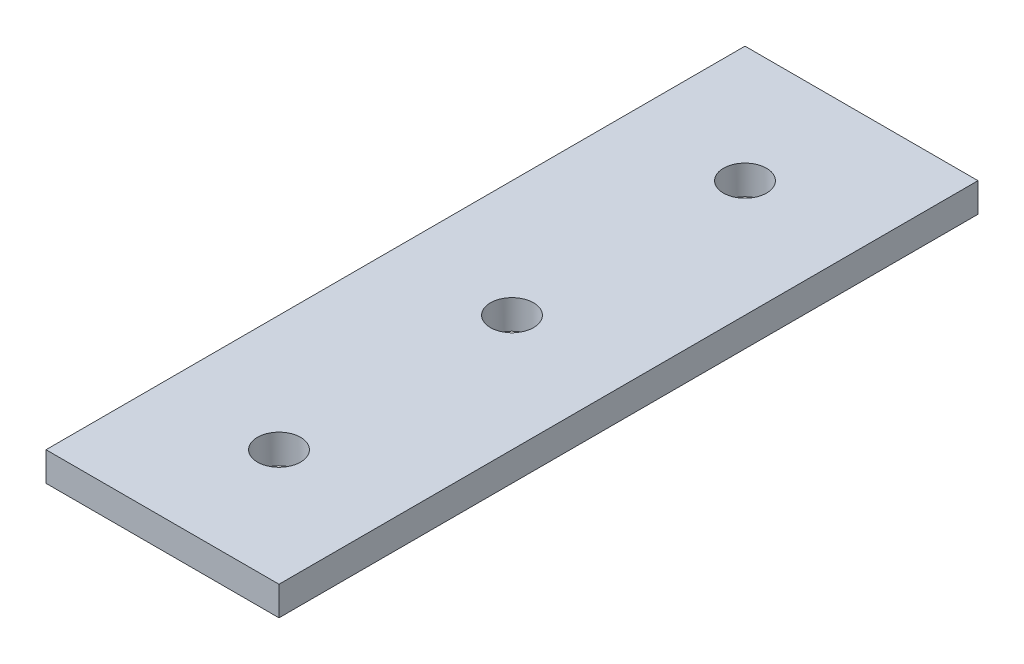
ISO-10303-21;
HEADER;
FILE_DESCRIPTION(('STEP AP214'),'2;1');
FILE_NAME('part.step','',(''),(''),'','','');
FILE_SCHEMA(('AUTOMOTIVE_DESIGN { 1 0 10303 214 1 1 1 1 }'));
ENDSEC;
DATA;
#1=APPLICATION_CONTEXT('core data for automotive mechanical design processes');
#2=APPLICATION_PROTOCOL_DEFINITION('international standard','automotive_design',2000,#1);
#3=PRODUCT_CONTEXT('',#1,'mechanical');
#4=PRODUCT('Part','Part','',(#3));
#5=PRODUCT_RELATED_PRODUCT_CATEGORY('part','',(#4));
#6=PRODUCT_DEFINITION_FORMATION('','',#4);
#7=PRODUCT_DEFINITION_CONTEXT('part definition',#1,'design');
#8=PRODUCT_DEFINITION('design','',#6,#7);
#9=PRODUCT_DEFINITION_SHAPE('','',#8);
#10=(LENGTH_UNIT() NAMED_UNIT(*) SI_UNIT(.MILLI.,.METRE.));
#11=(NAMED_UNIT(*) PLANE_ANGLE_UNIT() SI_UNIT($,.RADIAN.));
#12=(NAMED_UNIT(*) SI_UNIT($,.STERADIAN.) SOLID_ANGLE_UNIT());
#13=UNCERTAINTY_MEASURE_WITH_UNIT(LENGTH_MEASURE(1.E-05),#10,'distance_accuracy_value','');
#14=(GEOMETRIC_REPRESENTATION_CONTEXT(3) GLOBAL_UNCERTAINTY_ASSIGNED_CONTEXT((#13)) GLOBAL_UNIT_ASSIGNED_CONTEXT((#10,
#11,#12)) REPRESENTATION_CONTEXT('',''));
#15=CARTESIAN_POINT('',(0.,0.,0.));
#16=DIRECTION('',(0.,0.,1.));
#17=DIRECTION('',(1.,0.,0.));
#18=AXIS2_PLACEMENT_3D('',#15,#16,#17);
#19=CARTESIAN_POINT('',(-12.7,1.5875,38.1));
#20=DIRECTION('',(-1.,0.,0.));
#21=DIRECTION('',(0.,0.,1.));
#22=AXIS2_PLACEMENT_3D('',#19,#20,#21);
#23=PLANE('',#22);
#24=DIRECTION('',(0.,0.,-1.));
#25=VECTOR('',#24,1.);
#26=CARTESIAN_POINT('',(-12.7,-1.5875,38.1));
#27=LINE('',#26,#25);
#28=CARTESIAN_POINT('',(-12.7,-1.5875,38.1));
#29=VERTEX_POINT('',#28);
#30=CARTESIAN_POINT('',(-12.7,-1.5875,-38.1));
#31=VERTEX_POINT('',#30);
#32=EDGE_CURVE('E110',#29,#31,#27,.T.);
#33=ORIENTED_EDGE('',*,*,#32,.F.);
#34=DIRECTION('',(0.,-1.,0.));
#35=VECTOR('',#34,1.);
#36=CARTESIAN_POINT('',(-12.7,1.5875,38.1));
#37=LINE('',#36,#35);
#38=CARTESIAN_POINT('',(-12.7,1.5875,38.1));
#39=VERTEX_POINT('',#38);
#40=EDGE_CURVE('E11',#39,#29,#37,.T.);
#41=ORIENTED_EDGE('',*,*,#40,.F.);
#42=DIRECTION('',(0.,0.,-1.));
#43=VECTOR('',#42,1.);
#44=CARTESIAN_POINT('',(-12.7,1.5875,38.1));
#45=LINE('',#44,#43);
#46=CARTESIAN_POINT('',(-12.7,1.5875,-38.1));
#47=VERTEX_POINT('',#46);
#48=EDGE_CURVE('E102',#39,#47,#45,.T.);
#49=ORIENTED_EDGE('',*,*,#48,.T.);
#50=DIRECTION('',(0.,-1.,0.));
#51=VECTOR('',#50,1.);
#52=CARTESIAN_POINT('',(-12.7,1.5875,-38.1));
#53=LINE('',#52,#51);
#54=EDGE_CURVE('E41',#47,#31,#53,.T.);
#55=ORIENTED_EDGE('',*,*,#54,.T.);
#56=EDGE_LOOP('',(#33,#41,#49,#55));
#57=FACE_BOUND('',#56,.T.);
#58=ADVANCED_FACE('F38',(#57),#23,.T.);
#59=CARTESIAN_POINT('',(-12.7,1.5875,38.1));
#60=DIRECTION('',(0.,0.,-1.));
#61=DIRECTION('',(-1.,0.,0.));
#62=AXIS2_PLACEMENT_3D('',#59,#60,#61);
#63=PLANE('',#62);
#64=DIRECTION('',(1.,0.,0.));
#65=VECTOR('',#64,1.);
#66=CARTESIAN_POINT('',(-12.7,-1.5875,38.1));
#67=LINE('',#66,#65);
#68=CARTESIAN_POINT('',(12.7,-1.5875,38.1));
#69=VERTEX_POINT('',#68);
#70=EDGE_CURVE('E72',#29,#69,#67,.T.);
#71=ORIENTED_EDGE('',*,*,#70,.T.);
#72=DIRECTION('',(0.,-1.,0.));
#73=VECTOR('',#72,1.);
#74=CARTESIAN_POINT('',(12.7,1.5875,38.1));
#75=LINE('',#74,#73);
#76=CARTESIAN_POINT('',(12.7,1.5875,38.1));
#77=VERTEX_POINT('',#76);
#78=EDGE_CURVE('E48',#77,#69,#75,.T.);
#79=ORIENTED_EDGE('',*,*,#78,.F.);
#80=DIRECTION('',(1.,0.,0.));
#81=VECTOR('',#80,1.);
#82=CARTESIAN_POINT('',(-12.7,1.5875,38.1));
#83=LINE('',#82,#81);
#84=EDGE_CURVE('E89',#39,#77,#83,.T.);
#85=ORIENTED_EDGE('',*,*,#84,.F.);
#86=ORIENTED_EDGE('',*,*,#40,.T.);
#87=EDGE_LOOP('',(#71,#79,#85,#86));
#88=FACE_BOUND('',#87,.T.);
#89=ADVANCED_FACE('F127',(#88),#63,.F.);
#90=CARTESIAN_POINT('',(12.7,1.5875,38.1));
#91=DIRECTION('',(-1.,0.,0.));
#92=DIRECTION('',(0.,0.,1.));
#93=AXIS2_PLACEMENT_3D('',#90,#91,#92);
#94=PLANE('',#93);
#95=DIRECTION('',(0.,0.,-1.));
#96=VECTOR('',#95,1.);
#97=CARTESIAN_POINT('',(12.7,-1.5875,38.1));
#98=LINE('',#97,#96);
#99=CARTESIAN_POINT('',(12.7,-1.5875,-38.1));
#100=VERTEX_POINT('',#99);
#101=EDGE_CURVE('E97',#69,#100,#98,.T.);
#102=ORIENTED_EDGE('',*,*,#101,.T.);
#103=DIRECTION('',(0.,-1.,0.));
#104=VECTOR('',#103,1.);
#105=CARTESIAN_POINT('',(12.7,1.5875,-38.1));
#106=LINE('',#105,#104);
#107=CARTESIAN_POINT('',(12.7,1.5875,-38.1));
#108=VERTEX_POINT('',#107);
#109=EDGE_CURVE('E94',#108,#100,#106,.T.);
#110=ORIENTED_EDGE('',*,*,#109,.F.);
#111=DIRECTION('',(0.,0.,-1.));
#112=VECTOR('',#111,1.);
#113=CARTESIAN_POINT('',(12.7,1.5875,38.1));
#114=LINE('',#113,#112);
#115=EDGE_CURVE('E84',#77,#108,#114,.T.);
#116=ORIENTED_EDGE('',*,*,#115,.F.);
#117=ORIENTED_EDGE('',*,*,#78,.T.);
#118=EDGE_LOOP('',(#102,#110,#116,#117));
#119=FACE_BOUND('',#118,.T.);
#120=ADVANCED_FACE('F95',(#119),#94,.F.);
#121=CARTESIAN_POINT('',(-12.7,1.5875,-38.1));
#122=DIRECTION('',(0.,0.,-1.));
#123=DIRECTION('',(-1.,0.,0.));
#124=AXIS2_PLACEMENT_3D('',#121,#122,#123);
#125=PLANE('',#124);
#126=DIRECTION('',(1.,0.,0.));
#127=VECTOR('',#126,1.);
#128=CARTESIAN_POINT('',(-12.7,-1.5875,-38.1));
#129=LINE('',#128,#127);
#130=EDGE_CURVE('E114',#31,#100,#129,.T.);
#131=ORIENTED_EDGE('',*,*,#130,.F.);
#132=ORIENTED_EDGE('',*,*,#54,.F.);
#133=DIRECTION('',(1.,0.,0.));
#134=VECTOR('',#133,1.);
#135=CARTESIAN_POINT('',(-12.7,1.5875,-38.1));
#136=LINE('',#135,#134);
#137=EDGE_CURVE('E88',#47,#108,#136,.T.);
#138=ORIENTED_EDGE('',*,*,#137,.T.);
#139=ORIENTED_EDGE('',*,*,#109,.T.);
#140=EDGE_LOOP('',(#131,#132,#138,#139));
#141=FACE_BOUND('',#140,.T.);
#142=ADVANCED_FACE('F100',(#141),#125,.T.);
#143=CARTESIAN_POINT('',(0.,1.5875,0.));
#144=DIRECTION('',(0.,-1.,0.));
#145=DIRECTION('',(0.,0.,-1.));
#146=AXIS2_PLACEMENT_3D('',#143,#144,#145);
#147=PLANE('',#146);
#148=CARTESIAN_POINT('',(0.,1.5875,25.4));
#149=DIRECTION('',(0.,-1.,0.));
#150=DIRECTION('',(0.,0.,-1.));
#151=AXIS2_PLACEMENT_3D('',#148,#149,#150);
#152=CIRCLE('',#151,2.3495);
#153=CARTESIAN_POINT('',(0.,1.5875,23.0505));
#154=VERTEX_POINT('',#153);
#155=EDGE_CURVE('E115',#154,#154,#152,.T.);
#156=ORIENTED_EDGE('',*,*,#155,.T.);
#157=EDGE_LOOP('',(#156));
#158=FACE_BOUND('',#157,.T.);
#159=CARTESIAN_POINT('',(0.,1.5875,0.));
#160=DIRECTION('',(0.,-1.,0.));
#161=DIRECTION('',(0.,0.,-1.));
#162=AXIS2_PLACEMENT_3D('',#159,#160,#161);
#163=CIRCLE('',#162,2.3495);
#164=CARTESIAN_POINT('',(0.,1.5875,-2.3495));
#165=VERTEX_POINT('',#164);
#166=EDGE_CURVE('E169',#165,#165,#163,.T.);
#167=ORIENTED_EDGE('',*,*,#166,.T.);
#168=EDGE_LOOP('',(#167));
#169=FACE_BOUND('',#168,.T.);
#170=CARTESIAN_POINT('',(0.,1.5875,-25.4));
#171=DIRECTION('',(0.,-1.,0.));
#172=DIRECTION('',(0.,0.,-1.));
#173=AXIS2_PLACEMENT_3D('',#170,#171,#172);
#174=CIRCLE('',#173,2.3495);
#175=CARTESIAN_POINT('',(0.,1.5875,-27.7495));
#176=VERTEX_POINT('',#175);
#177=EDGE_CURVE('E172',#176,#176,#174,.T.);
#178=ORIENTED_EDGE('',*,*,#177,.T.);
#179=EDGE_LOOP('',(#178));
#180=FACE_BOUND('',#179,.T.);
#181=ORIENTED_EDGE('',*,*,#48,.F.);
#182=ORIENTED_EDGE('',*,*,#84,.T.);
#183=ORIENTED_EDGE('',*,*,#115,.T.);
#184=ORIENTED_EDGE('',*,*,#137,.F.);
#185=EDGE_LOOP('',(#181,#182,#183,#184));
#186=FACE_BOUND('',#185,.T.);
#187=ADVANCED_FACE('F87',(#158,#169,#180,#186),#147,.F.);
#188=CARTESIAN_POINT('',(0.,-1.5875,0.));
#189=DIRECTION('',(0.,-1.,0.));
#190=DIRECTION('',(0.,0.,-1.));
#191=AXIS2_PLACEMENT_3D('',#188,#189,#190);
#192=PLANE('',#191);
#193=CARTESIAN_POINT('',(0.,-1.5875,25.4));
#194=DIRECTION('',(0.,1.,0.));
#195=DIRECTION('',(0.,0.,1.));
#196=AXIS2_PLACEMENT_3D('',#193,#194,#195);
#197=CIRCLE('',#196,2.3495);
#198=CARTESIAN_POINT('',(0.,-1.5875,27.7495));
#199=VERTEX_POINT('',#198);
#200=EDGE_CURVE('E166',#199,#199,#197,.T.);
#201=ORIENTED_EDGE('',*,*,#200,.T.);
#202=EDGE_LOOP('',(#201));
#203=FACE_BOUND('',#202,.T.);
#204=CARTESIAN_POINT('',(0.,-1.5875,0.));
#205=DIRECTION('',(0.,1.,0.));
#206=DIRECTION('',(0.,0.,1.));
#207=AXIS2_PLACEMENT_3D('',#204,#205,#206);
#208=CIRCLE('',#207,2.3495);
#209=CARTESIAN_POINT('',(0.,-1.5875,2.3495));
#210=VERTEX_POINT('',#209);
#211=EDGE_CURVE('E182',#210,#210,#208,.T.);
#212=ORIENTED_EDGE('',*,*,#211,.T.);
#213=EDGE_LOOP('',(#212));
#214=FACE_BOUND('',#213,.T.);
#215=CARTESIAN_POINT('',(0.,-1.5875,-25.4));
#216=DIRECTION('',(0.,1.,0.));
#217=DIRECTION('',(0.,0.,1.));
#218=AXIS2_PLACEMENT_3D('',#215,#216,#217);
#219=CIRCLE('',#218,2.3495);
#220=CARTESIAN_POINT('',(0.,-1.5875,-23.0505));
#221=VERTEX_POINT('',#220);
#222=EDGE_CURVE('E178',#221,#221,#219,.T.);
#223=ORIENTED_EDGE('',*,*,#222,.T.);
#224=EDGE_LOOP('',(#223));
#225=FACE_BOUND('',#224,.T.);
#226=ORIENTED_EDGE('',*,*,#32,.T.);
#227=ORIENTED_EDGE('',*,*,#130,.T.);
#228=ORIENTED_EDGE('',*,*,#101,.F.);
#229=ORIENTED_EDGE('',*,*,#70,.F.);
#230=EDGE_LOOP('',(#226,#227,#228,#229));
#231=FACE_BOUND('',#230,.T.);
#232=ADVANCED_FACE('F124',(#203,#214,#225,#231),#192,.T.);
#233=CARTESIAN_POINT('',(0.,-1.5875,-25.4));
#234=DIRECTION('',(0.,1.,0.));
#235=DIRECTION('',(0.,0.,1.));
#236=AXIS2_PLACEMENT_3D('',#233,#234,#235);
#237=CYLINDRICAL_SURFACE('',#236,2.3495);
#238=ORIENTED_EDGE('',*,*,#222,.F.);
#239=EDGE_LOOP('',(#238));
#240=FACE_BOUND('',#239,.T.);
#241=ORIENTED_EDGE('',*,*,#177,.F.);
#242=EDGE_LOOP('',(#241));
#243=FACE_BOUND('',#242,.T.);
#244=ADVANCED_FACE('F146',(#240,#243),#237,.F.);
#245=CARTESIAN_POINT('',(0.,-1.5875,0.));
#246=DIRECTION('',(0.,1.,0.));
#247=DIRECTION('',(0.,0.,1.));
#248=AXIS2_PLACEMENT_3D('',#245,#246,#247);
#249=CYLINDRICAL_SURFACE('',#248,2.3495);
#250=ORIENTED_EDGE('',*,*,#211,.F.);
#251=EDGE_LOOP('',(#250));
#252=FACE_BOUND('',#251,.T.);
#253=ORIENTED_EDGE('',*,*,#166,.F.);
#254=EDGE_LOOP('',(#253));
#255=FACE_BOUND('',#254,.T.);
#256=ADVANCED_FACE('F153',(#252,#255),#249,.F.);
#257=CARTESIAN_POINT('',(0.,-1.5875,25.4));
#258=DIRECTION('',(0.,1.,0.));
#259=DIRECTION('',(0.,0.,1.));
#260=AXIS2_PLACEMENT_3D('',#257,#258,#259);
#261=CYLINDRICAL_SURFACE('',#260,2.3495);
#262=ORIENTED_EDGE('',*,*,#200,.F.);
#263=EDGE_LOOP('',(#262));
#264=FACE_BOUND('',#263,.T.);
#265=ORIENTED_EDGE('',*,*,#155,.F.);
#266=EDGE_LOOP('',(#265));
#267=FACE_BOUND('',#266,.T.);
#268=ADVANCED_FACE('F157',(#264,#267),#261,.F.);
#269=CLOSED_SHELL('',(#58,#89,#120,#142,#187,#232,#244,#256,#268));
#270=MANIFOLD_SOLID_BREP('B2',#269);
#271=ADVANCED_BREP_SHAPE_REPRESENTATION('',(#18,#270),#14);
#272=SHAPE_DEFINITION_REPRESENTATION(#9,#271);
ENDSEC;
END-ISO-10303-21;
